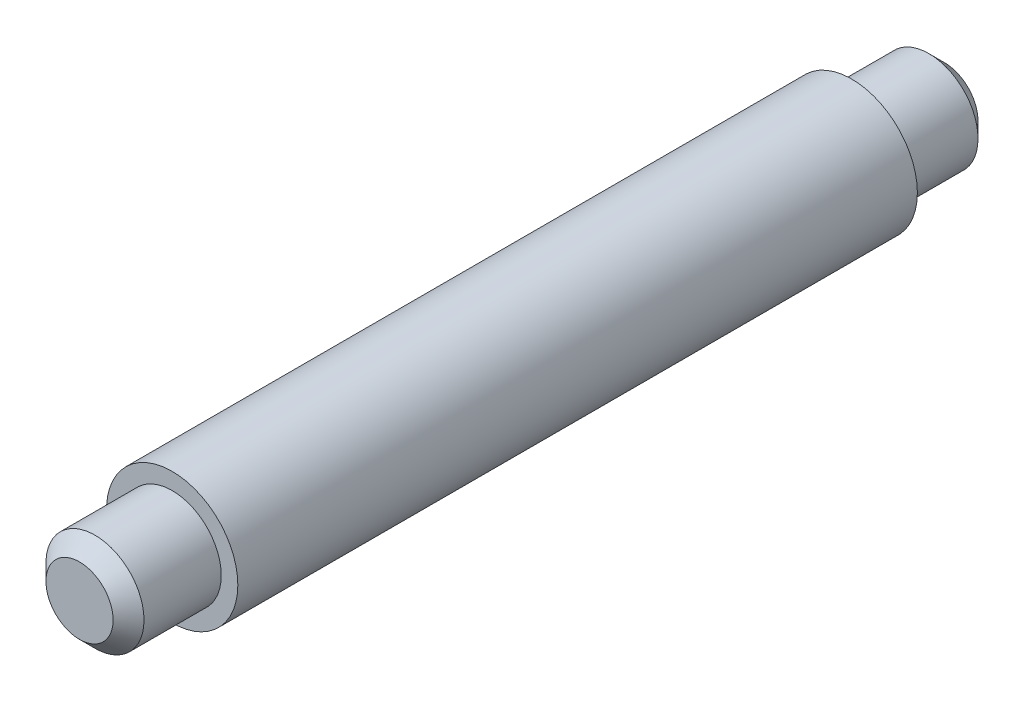
ISO-10303-21;
HEADER;
FILE_DESCRIPTION(('STEP AP214'),'2;1');
FILE_NAME('part.step','',(''),(''),'','','');
FILE_SCHEMA(('AUTOMOTIVE_DESIGN { 1 0 10303 214 1 1 1 1 }'));
ENDSEC;
DATA;
#1=APPLICATION_CONTEXT('core data for automotive mechanical design processes');
#2=APPLICATION_PROTOCOL_DEFINITION('international standard','automotive_design',2000,#1);
#3=PRODUCT_CONTEXT('',#1,'mechanical');
#4=PRODUCT('Part','Part','',(#3));
#5=PRODUCT_RELATED_PRODUCT_CATEGORY('part','',(#4));
#6=PRODUCT_DEFINITION_FORMATION('','',#4);
#7=PRODUCT_DEFINITION_CONTEXT('part definition',#1,'design');
#8=PRODUCT_DEFINITION('design','',#6,#7);
#9=PRODUCT_DEFINITION_SHAPE('','',#8);
#10=(LENGTH_UNIT() NAMED_UNIT(*) SI_UNIT(.MILLI.,.METRE.));
#11=(NAMED_UNIT(*) PLANE_ANGLE_UNIT() SI_UNIT($,.RADIAN.));
#12=(NAMED_UNIT(*) SI_UNIT($,.STERADIAN.) SOLID_ANGLE_UNIT());
#13=UNCERTAINTY_MEASURE_WITH_UNIT(LENGTH_MEASURE(1.E-05),#10,'distance_accuracy_value','');
#14=(GEOMETRIC_REPRESENTATION_CONTEXT(3) GLOBAL_UNCERTAINTY_ASSIGNED_CONTEXT((#13)) GLOBAL_UNIT_ASSIGNED_CONTEXT((#10,
#11,#12)) REPRESENTATION_CONTEXT('',''));
#15=CARTESIAN_POINT('',(0.,0.,0.));
#16=DIRECTION('',(0.,0.,1.));
#17=DIRECTION('',(1.,0.,0.));
#18=AXIS2_PLACEMENT_3D('',#15,#16,#17);
#19=CARTESIAN_POINT('',(0.,0.,22.));
#20=DIRECTION('',(0.,0.,-1.));
#21=DIRECTION('',(-1.,0.,0.));
#22=AXIS2_PLACEMENT_3D('',#19,#20,#21);
#23=CYLINDRICAL_SURFACE('',#22,4.25);
#24=CARTESIAN_POINT('',(0.,0.,22.));
#25=DIRECTION('',(0.,0.,1.));
#26=DIRECTION('',(1.,0.,0.));
#27=AXIS2_PLACEMENT_3D('',#24,#25,#26);
#28=CIRCLE('',#27,4.25);
#29=CARTESIAN_POINT('',(4.25,0.,22.));
#30=VERTEX_POINT('',#29);
#31=EDGE_CURVE('E69',#30,#30,#28,.T.);
#32=ORIENTED_EDGE('',*,*,#31,.F.);
#33=EDGE_LOOP('',(#32));
#34=FACE_BOUND('',#33,.T.);
#35=CARTESIAN_POINT('',(0.,0.,-22.));
#36=DIRECTION('',(0.,0.,1.));
#37=DIRECTION('',(1.,0.,0.));
#38=AXIS2_PLACEMENT_3D('',#35,#36,#37);
#39=CIRCLE('',#38,4.25);
#40=CARTESIAN_POINT('',(4.25,0.,-22.));
#41=VERTEX_POINT('',#40);
#42=EDGE_CURVE('E65',#41,#41,#39,.T.);
#43=ORIENTED_EDGE('',*,*,#42,.T.);
#44=EDGE_LOOP('',(#43));
#45=FACE_BOUND('',#44,.T.);
#46=ADVANCED_FACE('F39',(#34,#45),#23,.T.);
#47=CARTESIAN_POINT('',(0.,0.,22.));
#48=DIRECTION('',(0.,0.,1.));
#49=DIRECTION('',(1.,0.,0.));
#50=AXIS2_PLACEMENT_3D('',#47,#48,#49);
#51=PLANE('',#50);
#52=CARTESIAN_POINT('',(0.,0.,22.));
#53=DIRECTION('',(0.,0.,1.));
#54=DIRECTION('',(1.,0.,0.));
#55=AXIS2_PLACEMENT_3D('',#52,#53,#54);
#56=CIRCLE('',#55,3.175);
#57=CARTESIAN_POINT('',(3.175,0.,22.));
#58=VERTEX_POINT('',#57);
#59=EDGE_CURVE('E64',#58,#58,#56,.T.);
#60=ORIENTED_EDGE('',*,*,#59,.F.);
#61=EDGE_LOOP('',(#60));
#62=FACE_BOUND('',#61,.T.);
#63=ORIENTED_EDGE('',*,*,#31,.T.);
#64=EDGE_LOOP('',(#63));
#65=FACE_BOUND('',#64,.T.);
#66=ADVANCED_FACE('F98',(#62,#65),#51,.T.);
#67=CARTESIAN_POINT('',(0.,0.,-22.));
#68=DIRECTION('',(0.,0.,1.));
#69=DIRECTION('',(1.,0.,0.));
#70=AXIS2_PLACEMENT_3D('',#67,#68,#69);
#71=PLANE('',#70);
#72=CARTESIAN_POINT('',(0.,0.,-22.));
#73=DIRECTION('',(0.,0.,1.));
#74=DIRECTION('',(1.,0.,0.));
#75=AXIS2_PLACEMENT_3D('',#72,#73,#74);
#76=CIRCLE('',#75,3.175);
#77=CARTESIAN_POINT('',(3.175,0.,-22.));
#78=VERTEX_POINT('',#77);
#79=EDGE_CURVE('E70',#78,#78,#76,.T.);
#80=ORIENTED_EDGE('',*,*,#79,.T.);
#81=EDGE_LOOP('',(#80));
#82=FACE_BOUND('',#81,.T.);
#83=ORIENTED_EDGE('',*,*,#42,.F.);
#84=EDGE_LOOP('',(#83));
#85=FACE_BOUND('',#84,.T.);
#86=ADVANCED_FACE('F81',(#82,#85),#71,.F.);
#87=CARTESIAN_POINT('',(0.,0.,28.));
#88=DIRECTION('',(0.,0.,-1.));
#89=DIRECTION('',(-1.,0.,0.));
#90=AXIS2_PLACEMENT_3D('',#87,#88,#89);
#91=CYLINDRICAL_SURFACE('',#90,3.175);
#92=CARTESIAN_POINT('',(0.,0.,27.));
#93=DIRECTION('',(0.,0.,1.));
#94=DIRECTION('',(1.,0.,0.));
#95=AXIS2_PLACEMENT_3D('',#92,#93,#94);
#96=CIRCLE('',#95,3.175);
#97=CARTESIAN_POINT('',(3.175,0.,27.));
#98=VERTEX_POINT('',#97);
#99=EDGE_CURVE('E53',#98,#98,#96,.F.);
#100=ORIENTED_EDGE('',*,*,#99,.T.);
#101=EDGE_LOOP('',(#100));
#102=FACE_BOUND('',#101,.T.);
#103=ORIENTED_EDGE('',*,*,#59,.T.);
#104=EDGE_LOOP('',(#103));
#105=FACE_BOUND('',#104,.T.);
#106=ADVANCED_FACE('F115',(#102,#105),#91,.T.);
#107=CARTESIAN_POINT('',(0.,0.,28.));
#108=DIRECTION('',(0.,0.,1.));
#109=DIRECTION('',(1.,0.,0.));
#110=AXIS2_PLACEMENT_3D('',#107,#108,#109);
#111=PLANE('',#110);
#112=CARTESIAN_POINT('',(0.,0.,28.));
#113=DIRECTION('',(0.,0.,1.));
#114=DIRECTION('',(1.,0.,0.));
#115=AXIS2_PLACEMENT_3D('',#112,#113,#114);
#116=CIRCLE('',#115,2.175);
#117=CARTESIAN_POINT('',(2.175,0.,28.));
#118=VERTEX_POINT('',#117);
#119=EDGE_CURVE('E58',#118,#118,#116,.T.);
#120=ORIENTED_EDGE('',*,*,#119,.T.);
#121=EDGE_LOOP('',(#120));
#122=FACE_BOUND('',#121,.T.);
#123=ADVANCED_FACE('F94',(#122),#111,.T.);
#124=CARTESIAN_POINT('',(0.,0.,28.));
#125=DIRECTION('',(0.,0.,-1.));
#126=DIRECTION('',(-1.,0.,0.));
#127=AXIS2_PLACEMENT_3D('',#124,#125,#126);
#128=CONICAL_SURFACE('',#127,2.175,0.785398163397443);
#129=ORIENTED_EDGE('',*,*,#99,.F.);
#130=EDGE_LOOP('',(#129));
#131=FACE_BOUND('',#130,.T.);
#132=ORIENTED_EDGE('',*,*,#119,.F.);
#133=EDGE_LOOP('',(#132));
#134=FACE_BOUND('',#133,.T.);
#135=ADVANCED_FACE('F87',(#131,#134),#128,.T.);
#136=CARTESIAN_POINT('',(0.,0.,-28.));
#137=DIRECTION('',(0.,0.,1.));
#138=DIRECTION('',(1.,0.,0.));
#139=AXIS2_PLACEMENT_3D('',#136,#137,#138);
#140=CYLINDRICAL_SURFACE('',#139,3.175);
#141=CARTESIAN_POINT('',(0.,0.,-27.));
#142=DIRECTION('',(0.,0.,-1.));
#143=DIRECTION('',(-1.,0.,0.));
#144=AXIS2_PLACEMENT_3D('',#141,#142,#143);
#145=CIRCLE('',#144,3.175);
#146=CARTESIAN_POINT('',(-3.175,0.,-27.));
#147=VERTEX_POINT('',#146);
#148=EDGE_CURVE('E48',#147,#147,#145,.F.);
#149=ORIENTED_EDGE('',*,*,#148,.T.);
#150=EDGE_LOOP('',(#149));
#151=FACE_BOUND('',#150,.T.);
#152=ORIENTED_EDGE('',*,*,#79,.F.);
#153=EDGE_LOOP('',(#152));
#154=FACE_BOUND('',#153,.T.);
#155=ADVANCED_FACE('F84',(#151,#154),#140,.T.);
#156=CARTESIAN_POINT('',(0.,0.,-28.));
#157=DIRECTION('',(0.,0.,-1.));
#158=DIRECTION('',(1.,0.,0.));
#159=AXIS2_PLACEMENT_3D('',#156,#157,#158);
#160=PLANE('',#159);
#161=CARTESIAN_POINT('',(0.,0.,-28.));
#162=DIRECTION('',(0.,0.,-1.));
#163=DIRECTION('',(-1.,0.,0.));
#164=AXIS2_PLACEMENT_3D('',#161,#162,#163);
#165=CIRCLE('',#164,2.17499999999999);
#166=CARTESIAN_POINT('',(-2.17499999999999,0.,-28.));
#167=VERTEX_POINT('',#166);
#168=EDGE_CURVE('E10',#167,#167,#165,.T.);
#169=ORIENTED_EDGE('',*,*,#168,.T.);
#170=EDGE_LOOP('',(#169));
#171=FACE_BOUND('',#170,.T.);
#172=ADVANCED_FACE('F86',(#171),#160,.T.);
#173=CARTESIAN_POINT('',(0.,0.,-27.));
#174=DIRECTION('',(0.,0.,1.));
#175=DIRECTION('',(1.,0.,0.));
#176=AXIS2_PLACEMENT_3D('',#173,#174,#175);
#177=CONICAL_SURFACE('',#176,3.175,0.785398163397449);
#178=ORIENTED_EDGE('',*,*,#168,.F.);
#179=EDGE_LOOP('',(#178));
#180=FACE_BOUND('',#179,.T.);
#181=ORIENTED_EDGE('',*,*,#148,.F.);
#182=EDGE_LOOP('',(#181));
#183=FACE_BOUND('',#182,.T.);
#184=ADVANCED_FACE('F42',(#180,#183),#177,.T.);
#185=CLOSED_SHELL('',(#46,#66,#86,#106,#123,#135,#155,#172,#184));
#186=MANIFOLD_SOLID_BREP('B2',#185);
#187=ADVANCED_BREP_SHAPE_REPRESENTATION('',(#18,#186),#14);
#188=SHAPE_DEFINITION_REPRESENTATION(#9,#187);
ENDSEC;
END-ISO-10303-21;
